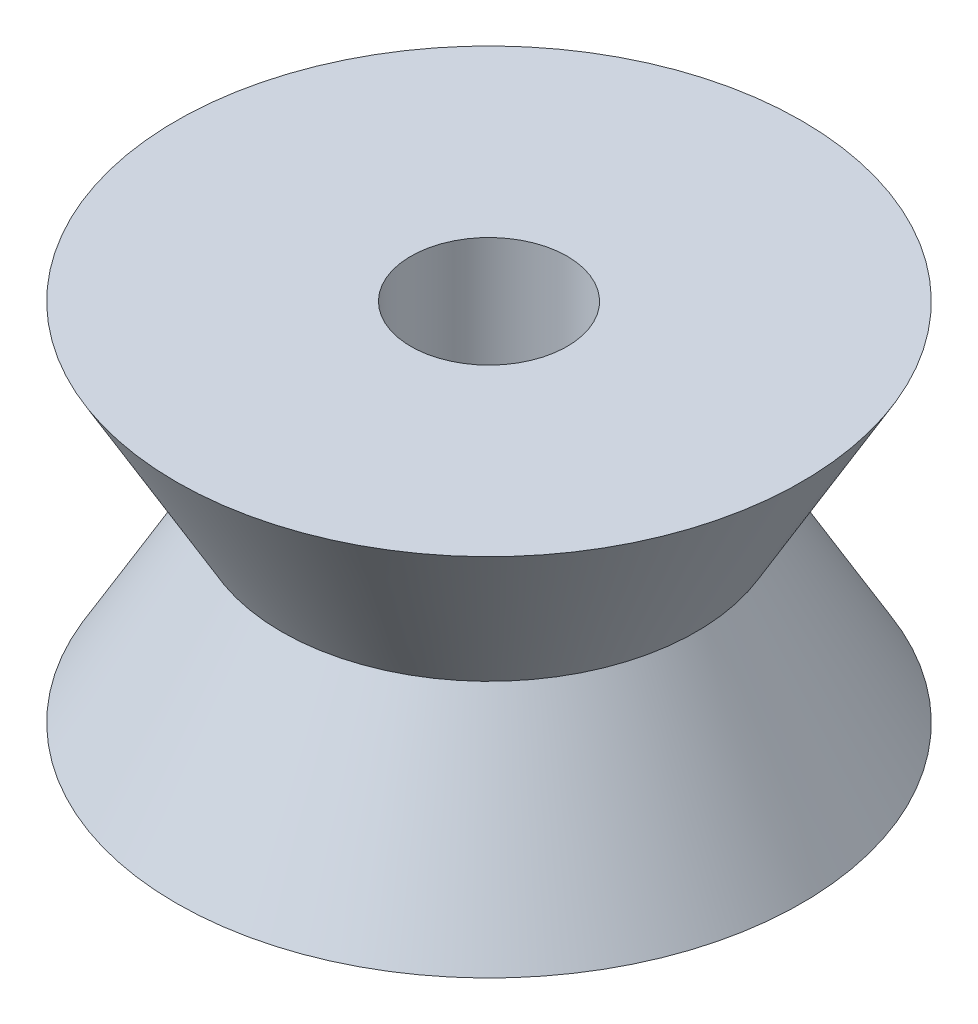
ISO-10303-21;
HEADER;
FILE_DESCRIPTION(('STEP AP214'),'2;1');
FILE_NAME('part.step','',(''),(''),'','','');
FILE_SCHEMA(('AUTOMOTIVE_DESIGN { 1 0 10303 214 1 1 1 1 }'));
ENDSEC;
DATA;
#1=APPLICATION_CONTEXT('core data for automotive mechanical design processes');
#2=APPLICATION_PROTOCOL_DEFINITION('international standard','automotive_design',2000,#1);
#3=PRODUCT_CONTEXT('',#1,'mechanical');
#4=PRODUCT('Part','Part','',(#3));
#5=PRODUCT_RELATED_PRODUCT_CATEGORY('part','',(#4));
#6=PRODUCT_DEFINITION_FORMATION('','',#4);
#7=PRODUCT_DEFINITION_CONTEXT('part definition',#1,'design');
#8=PRODUCT_DEFINITION('design','',#6,#7);
#9=PRODUCT_DEFINITION_SHAPE('','',#8);
#10=(LENGTH_UNIT() NAMED_UNIT(*) SI_UNIT(.MILLI.,.METRE.));
#11=(NAMED_UNIT(*) PLANE_ANGLE_UNIT() SI_UNIT($,.RADIAN.));
#12=(NAMED_UNIT(*) SI_UNIT($,.STERADIAN.) SOLID_ANGLE_UNIT());
#13=UNCERTAINTY_MEASURE_WITH_UNIT(LENGTH_MEASURE(1.E-05),#10,'distance_accuracy_value','');
#14=(GEOMETRIC_REPRESENTATION_CONTEXT(3) GLOBAL_UNCERTAINTY_ASSIGNED_CONTEXT((#13)) GLOBAL_UNIT_ASSIGNED_CONTEXT((#10,
#11,#12)) REPRESENTATION_CONTEXT('',''));
#15=CARTESIAN_POINT('',(0.,0.,0.));
#16=DIRECTION('',(0.,0.,1.));
#17=DIRECTION('',(1.,0.,0.));
#18=AXIS2_PLACEMENT_3D('',#15,#16,#17);
#19=CARTESIAN_POINT('',(1.5,3.5,0.));
#20=DIRECTION('',(0.,1.,0.));
#21=DIRECTION('',(0.,0.,1.));
#22=AXIS2_PLACEMENT_3D('',#19,#20,#21);
#23=PLANE('',#22);
#24=CARTESIAN_POINT('',(0.,3.5,0.));
#25=DIRECTION('',(0.,-1.,0.));
#26=DIRECTION('',(0.,0.,-1.));
#27=AXIS2_PLACEMENT_3D('',#24,#25,#26);
#28=CIRCLE('',#27,1.5);
#29=CARTESIAN_POINT('',(0.,3.5,-1.5));
#30=VERTEX_POINT('',#29);
#31=EDGE_CURVE('E10',#30,#30,#28,.T.);
#32=ORIENTED_EDGE('',*,*,#31,.T.);
#33=EDGE_LOOP('',(#32));
#34=FACE_BOUND('',#33,.T.);
#35=CARTESIAN_POINT('',(0.,3.5,0.));
#36=DIRECTION('',(0.,-1.,0.));
#37=DIRECTION('',(0.,0.,-1.));
#38=AXIS2_PLACEMENT_3D('',#35,#36,#37);
#39=CIRCLE('',#38,6.);
#40=CARTESIAN_POINT('',(0.,3.5,-6.));
#41=VERTEX_POINT('',#40);
#42=EDGE_CURVE('E50',#41,#41,#39,.T.);
#43=ORIENTED_EDGE('',*,*,#42,.F.);
#44=EDGE_LOOP('',(#43));
#45=FACE_BOUND('',#44,.T.);
#46=ADVANCED_FACE('F31',(#34,#45),#23,.T.);
#47=CARTESIAN_POINT('',(0.,0.,0.));
#48=DIRECTION('',(0.,-1.,0.));
#49=DIRECTION('',(0.,0.,-1.));
#50=AXIS2_PLACEMENT_3D('',#47,#48,#49);
#51=CYLINDRICAL_SURFACE('',#50,1.5);
#52=CARTESIAN_POINT('',(0.,-3.5,0.));
#53=DIRECTION('',(0.,-1.,0.));
#54=DIRECTION('',(0.,0.,-1.));
#55=AXIS2_PLACEMENT_3D('',#52,#53,#54);
#56=CIRCLE('',#55,1.5);
#57=CARTESIAN_POINT('',(0.,-3.5,-1.5));
#58=VERTEX_POINT('',#57);
#59=EDGE_CURVE('E37',#58,#58,#56,.T.);
#60=ORIENTED_EDGE('',*,*,#59,.T.);
#61=EDGE_LOOP('',(#60));
#62=FACE_BOUND('',#61,.T.);
#63=ORIENTED_EDGE('',*,*,#31,.F.);
#64=EDGE_LOOP('',(#63));
#65=FACE_BOUND('',#64,.T.);
#66=ADVANCED_FACE('F58',(#62,#65),#51,.F.);
#67=CARTESIAN_POINT('',(1.5,-3.5,0.));
#68=DIRECTION('',(0.,-1.,0.));
#69=DIRECTION('',(0.,0.,-1.));
#70=AXIS2_PLACEMENT_3D('',#67,#68,#69);
#71=PLANE('',#70);
#72=CARTESIAN_POINT('',(0.,-3.5,0.));
#73=DIRECTION('',(0.,-1.,0.));
#74=DIRECTION('',(0.,0.,-1.));
#75=AXIS2_PLACEMENT_3D('',#72,#73,#74);
#76=CIRCLE('',#75,6.);
#77=CARTESIAN_POINT('',(0.,-3.5,-6.));
#78=VERTEX_POINT('',#77);
#79=EDGE_CURVE('E41',#78,#78,#76,.T.);
#80=ORIENTED_EDGE('',*,*,#79,.T.);
#81=EDGE_LOOP('',(#80));
#82=FACE_BOUND('',#81,.T.);
#83=ORIENTED_EDGE('',*,*,#59,.F.);
#84=EDGE_LOOP('',(#83));
#85=FACE_BOUND('',#84,.T.);
#86=ADVANCED_FACE('F62',(#82,#85),#71,.T.);
#87=CARTESIAN_POINT('',(0.,-3.5,0.));
#88=DIRECTION('',(0.,-1.,0.));
#89=DIRECTION('',(0.,0.,-1.));
#90=AXIS2_PLACEMENT_3D('',#87,#88,#89);
#91=CONICAL_SURFACE('',#90,6.,0.523598775598297);
#92=CARTESIAN_POINT('',(0.,0.,0.));
#93=DIRECTION('',(0.,-1.,0.));
#94=DIRECTION('',(0.,0.,-1.));
#95=AXIS2_PLACEMENT_3D('',#92,#93,#94);
#96=CIRCLE('',#95,3.97927405783632);
#97=CARTESIAN_POINT('',(0.,0.,-3.97927405783632));
#98=VERTEX_POINT('',#97);
#99=EDGE_CURVE('E45',#98,#98,#96,.T.);
#100=ORIENTED_EDGE('',*,*,#99,.T.);
#101=EDGE_LOOP('',(#100));
#102=FACE_BOUND('',#101,.T.);
#103=ORIENTED_EDGE('',*,*,#79,.F.);
#104=EDGE_LOOP('',(#103));
#105=FACE_BOUND('',#104,.T.);
#106=ADVANCED_FACE('F66',(#102,#105),#91,.T.);
#107=CARTESIAN_POINT('',(0.,0.,0.));
#108=DIRECTION('',(0.,1.,0.));
#109=DIRECTION('',(0.,0.,1.));
#110=AXIS2_PLACEMENT_3D('',#107,#108,#109);
#111=CONICAL_SURFACE('',#110,3.97927405783632,0.523598775598297);
#112=ORIENTED_EDGE('',*,*,#42,.T.);
#113=EDGE_LOOP('',(#112));
#114=FACE_BOUND('',#113,.T.);
#115=ORIENTED_EDGE('',*,*,#99,.F.);
#116=EDGE_LOOP('',(#115));
#117=FACE_BOUND('',#116,.T.);
#118=ADVANCED_FACE('F54',(#114,#117),#111,.T.);
#119=CLOSED_SHELL('',(#46,#66,#86,#106,#118));
#120=MANIFOLD_SOLID_BREP('B2',#119);
#121=ADVANCED_BREP_SHAPE_REPRESENTATION('',(#18,#120),#14);
#122=SHAPE_DEFINITION_REPRESENTATION(#9,#121);
ENDSEC;
END-ISO-10303-21;
